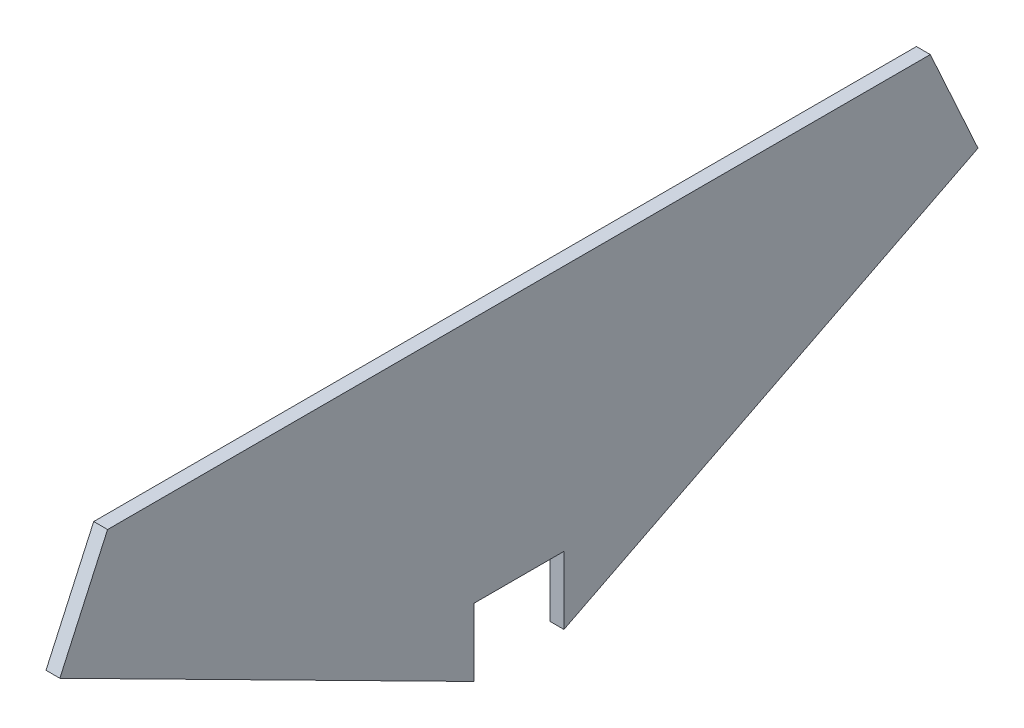
ISO-10303-21;
HEADER;
FILE_DESCRIPTION(('STEP AP214'),'2;1');
FILE_NAME('part.step','',(''),(''),'','','');
FILE_SCHEMA(('AUTOMOTIVE_DESIGN { 1 0 10303 214 1 1 1 1 }'));
ENDSEC;
DATA;
#1=APPLICATION_CONTEXT('core data for automotive mechanical design processes');
#2=APPLICATION_PROTOCOL_DEFINITION('international standard','automotive_design',2000,#1);
#3=PRODUCT_CONTEXT('',#1,'mechanical');
#4=PRODUCT('Part','Part','',(#3));
#5=PRODUCT_RELATED_PRODUCT_CATEGORY('part','',(#4));
#6=PRODUCT_DEFINITION_FORMATION('','',#4);
#7=PRODUCT_DEFINITION_CONTEXT('part definition',#1,'design');
#8=PRODUCT_DEFINITION('design','',#6,#7);
#9=PRODUCT_DEFINITION_SHAPE('','',#8);
#10=(LENGTH_UNIT() NAMED_UNIT(*) SI_UNIT(.MILLI.,.METRE.));
#11=(NAMED_UNIT(*) PLANE_ANGLE_UNIT() SI_UNIT($,.RADIAN.));
#12=(NAMED_UNIT(*) SI_UNIT($,.STERADIAN.) SOLID_ANGLE_UNIT());
#13=UNCERTAINTY_MEASURE_WITH_UNIT(LENGTH_MEASURE(1.E-05),#10,'distance_accuracy_value','');
#14=(GEOMETRIC_REPRESENTATION_CONTEXT(3) GLOBAL_UNCERTAINTY_ASSIGNED_CONTEXT((#13)) GLOBAL_UNIT_ASSIGNED_CONTEXT((#10,
#11,#12)) REPRESENTATION_CONTEXT('',''));
#15=CARTESIAN_POINT('',(0.,0.,0.));
#16=DIRECTION('',(0.,0.,1.));
#17=DIRECTION('',(1.,0.,0.));
#18=AXIS2_PLACEMENT_3D('',#15,#16,#17);
#19=CARTESIAN_POINT('',(6.,75.1104602945465,-173.429755419266));
#20=DIRECTION('',(0.,-0.413802944301184,0.910366477462605));
#21=DIRECTION('',(0.,-0.910366477462605,-0.413802944301184));
#22=AXIS2_PLACEMENT_3D('',#19,#20,#21);
#23=PLANE('',#22);
#24=DIRECTION('',(0.,0.910366477462605,0.413802944301184));
#25=VECTOR('',#24,1.);
#26=CARTESIAN_POINT('',(0.,75.1104602945465,-173.429755419266));
#27=LINE('',#26,#25);
#28=CARTESIAN_POINT('',(0.,29.6516334194965,-194.092858544289));
#29=VERTEX_POINT('',#28);
#30=CARTESIAN_POINT('',(0.,75.1104602945465,-173.429755419266));
#31=VERTEX_POINT('',#30);
#32=EDGE_CURVE('E129',#29,#31,#27,.T.);
#33=ORIENTED_EDGE('',*,*,#32,.T.);
#34=DIRECTION('',(-1.,0.,0.));
#35=VECTOR('',#34,1.);
#36=CARTESIAN_POINT('',(6.,75.1104602945465,-173.429755419266));
#37=LINE('',#36,#35);
#38=CARTESIAN_POINT('',(6.,75.1104602945465,-173.429755419266));
#39=VERTEX_POINT('',#38);
#40=EDGE_CURVE('E11',#39,#31,#37,.T.);
#41=ORIENTED_EDGE('',*,*,#40,.F.);
#42=DIRECTION('',(0.,0.910366477462605,0.413802944301184));
#43=VECTOR('',#42,1.);
#44=CARTESIAN_POINT('',(6.,75.1104602945465,-173.429755419266));
#45=LINE('',#44,#43);
#46=CARTESIAN_POINT('',(6.,29.6516334194965,-194.092858544289));
#47=VERTEX_POINT('',#46);
#48=EDGE_CURVE('E143',#47,#39,#45,.T.);
#49=ORIENTED_EDGE('',*,*,#48,.F.);
#50=DIRECTION('',(-1.,0.,0.));
#51=VECTOR('',#50,1.);
#52=CARTESIAN_POINT('',(6.,29.6516334194965,-194.092858544289));
#53=LINE('',#52,#51);
#54=EDGE_CURVE('E125',#47,#29,#53,.T.);
#55=ORIENTED_EDGE('',*,*,#54,.T.);
#56=EDGE_LOOP('',(#33,#41,#49,#55));
#57=FACE_BOUND('',#56,.T.);
#58=ADVANCED_FACE('F33',(#57),#23,.F.);
#59=CARTESIAN_POINT('',(6.,75.1104602945465,-173.429755419266));
#60=DIRECTION('',(0.,-1.,0.));
#61=DIRECTION('',(0.,0.,-1.));
#62=AXIS2_PLACEMENT_3D('',#59,#60,#61);
#63=PLANE('',#62);
#64=DIRECTION('',(0.,0.,1.));
#65=VECTOR('',#64,1.);
#66=CARTESIAN_POINT('',(0.,75.1104602945465,-173.429755419266));
#67=LINE('',#66,#65);
#68=CARTESIAN_POINT('',(0.,75.1104602945465,182.858071121388));
#69=VERTEX_POINT('',#68);
#70=EDGE_CURVE('E132',#31,#69,#67,.T.);
#71=ORIENTED_EDGE('',*,*,#70,.T.);
#72=DIRECTION('',(-1.,0.,0.));
#73=VECTOR('',#72,1.);
#74=CARTESIAN_POINT('',(6.,75.1104602945465,182.858071121388));
#75=LINE('',#74,#73);
#76=CARTESIAN_POINT('',(6.,75.1104602945465,182.858071121388));
#77=VERTEX_POINT('',#76);
#78=EDGE_CURVE('E41',#77,#69,#75,.T.);
#79=ORIENTED_EDGE('',*,*,#78,.F.);
#80=DIRECTION('',(0.,0.,1.));
#81=VECTOR('',#80,1.);
#82=CARTESIAN_POINT('',(6.,75.1104602945465,-173.429755419266));
#83=LINE('',#82,#81);
#84=EDGE_CURVE('E92',#39,#77,#83,.T.);
#85=ORIENTED_EDGE('',*,*,#84,.F.);
#86=ORIENTED_EDGE('',*,*,#40,.T.);
#87=EDGE_LOOP('',(#71,#79,#85,#86));
#88=FACE_BOUND('',#87,.T.);
#89=ADVANCED_FACE('F178',(#88),#63,.F.);
#90=CARTESIAN_POINT('',(6.,75.1104602945465,182.858071121388));
#91=DIRECTION('',(0.,-0.413802944301185,-0.910366477462604));
#92=DIRECTION('',(0.,0.910366477462605,-0.413802944301185));
#93=AXIS2_PLACEMENT_3D('',#90,#91,#92);
#94=PLANE('',#93);
#95=DIRECTION('',(0.,-0.910366477462604,0.413802944301185));
#96=VECTOR('',#95,1.);
#97=CARTESIAN_POINT('',(0.,75.1104602945465,182.858071121388));
#98=LINE('',#97,#96);
#99=CARTESIAN_POINT('',(0.,29.6516334194964,203.52117424641));
#100=VERTEX_POINT('',#99);
#101=EDGE_CURVE('E134',#69,#100,#98,.T.);
#102=ORIENTED_EDGE('',*,*,#101,.T.);
#103=DIRECTION('',(-1.,0.,0.));
#104=VECTOR('',#103,1.);
#105=CARTESIAN_POINT('',(6.,29.6516334194964,203.52117424641));
#106=LINE('',#105,#104);
#107=CARTESIAN_POINT('',(6.,29.6516334194964,203.52117424641));
#108=VERTEX_POINT('',#107);
#109=EDGE_CURVE('E150',#108,#100,#106,.T.);
#110=ORIENTED_EDGE('',*,*,#109,.F.);
#111=DIRECTION('',(0.,-0.910366477462604,0.413802944301185));
#112=VECTOR('',#111,1.);
#113=CARTESIAN_POINT('',(6.,75.1104602945465,182.858071121388));
#114=LINE('',#113,#112);
#115=EDGE_CURVE('E158',#77,#108,#114,.T.);
#116=ORIENTED_EDGE('',*,*,#115,.F.);
#117=ORIENTED_EDGE('',*,*,#78,.T.);
#118=EDGE_LOOP('',(#102,#110,#116,#117));
#119=FACE_BOUND('',#118,.T.);
#120=ADVANCED_FACE('F156',(#119),#94,.F.);
#121=CARTESIAN_POINT('',(6.,29.6516334194964,203.52117424641));
#122=DIRECTION('',(0.,0.892043028914365,-0.451950478000948));
#123=DIRECTION('',(0.,0.451950478000948,0.892043028914365));
#124=AXIS2_PLACEMENT_3D('',#121,#122,#123);
#125=PLANE('',#124);
#126=DIRECTION('',(0.,-0.451950478000948,-0.892043028914365));
#127=VECTOR('',#126,1.);
#128=CARTESIAN_POINT('',(0.,29.6516334194964,203.52117424641));
#129=LINE('',#128,#127);
#130=CARTESIAN_POINT('',(0.,-61.1936387726162,24.2141578510609));
#131=VERTEX_POINT('',#130);
#132=EDGE_CURVE('E136',#100,#131,#129,.T.);
#133=ORIENTED_EDGE('',*,*,#132,.T.);
#134=DIRECTION('',(-1.,0.,0.));
#135=VECTOR('',#134,1.);
#136=CARTESIAN_POINT('',(6.,-61.1936387726162,24.2141578510609));
#137=LINE('',#136,#135);
#138=CARTESIAN_POINT('',(6.,-61.1936387726162,24.2141578510609));
#139=VERTEX_POINT('',#138);
#140=EDGE_CURVE('E147',#139,#131,#137,.T.);
#141=ORIENTED_EDGE('',*,*,#140,.F.);
#142=DIRECTION('',(0.,-0.451950478000948,-0.892043028914365));
#143=VECTOR('',#142,1.);
#144=CARTESIAN_POINT('',(6.,29.6516334194964,203.52117424641));
#145=LINE('',#144,#143);
#146=EDGE_CURVE('E170',#108,#139,#145,.T.);
#147=ORIENTED_EDGE('',*,*,#146,.F.);
#148=ORIENTED_EDGE('',*,*,#109,.T.);
#149=EDGE_LOOP('',(#133,#141,#147,#148));
#150=FACE_BOUND('',#149,.T.);
#151=ADVANCED_FACE('F166',(#150),#125,.F.);
#152=CARTESIAN_POINT('',(6.,-61.1936387726162,24.2141578510609));
#153=DIRECTION('',(0.,0.,1.));
#154=DIRECTION('',(1.,0.,0.));
#155=AXIS2_PLACEMENT_3D('',#152,#153,#154);
#156=PLANE('',#155);
#157=DIRECTION('',(0.,1.,0.));
#158=VECTOR('',#157,1.);
#159=CARTESIAN_POINT('',(0.,-61.1936387726162,24.2141578510609));
#160=LINE('',#159,#158);
#161=CARTESIAN_POINT('',(0.,-31.8895397054537,24.2141578510609));
#162=VERTEX_POINT('',#161);
#163=EDGE_CURVE('E138',#131,#162,#160,.T.);
#164=ORIENTED_EDGE('',*,*,#163,.T.);
#165=DIRECTION('',(-1.,0.,0.));
#166=VECTOR('',#165,1.);
#167=CARTESIAN_POINT('',(6.,-31.8895397054537,24.2141578510609));
#168=LINE('',#167,#166);
#169=CARTESIAN_POINT('',(6.,-31.8895397054537,24.2141578510609));
#170=VERTEX_POINT('',#169);
#171=EDGE_CURVE('E120',#170,#162,#168,.T.);
#172=ORIENTED_EDGE('',*,*,#171,.F.);
#173=DIRECTION('',(0.,1.,0.));
#174=VECTOR('',#173,1.);
#175=CARTESIAN_POINT('',(6.,-61.1936387726162,24.2141578510609));
#176=LINE('',#175,#174);
#177=EDGE_CURVE('E111',#139,#170,#176,.T.);
#178=ORIENTED_EDGE('',*,*,#177,.F.);
#179=ORIENTED_EDGE('',*,*,#140,.T.);
#180=EDGE_LOOP('',(#164,#172,#178,#179));
#181=FACE_BOUND('',#180,.T.);
#182=ADVANCED_FACE('F169',(#181),#156,.F.);
#183=CARTESIAN_POINT('',(6.,-31.8895397054537,24.2141578510609));
#184=DIRECTION('',(0.,1.,0.));
#185=DIRECTION('',(0.,0.,1.));
#186=AXIS2_PLACEMENT_3D('',#183,#184,#185);
#187=PLANE('',#186);
#188=DIRECTION('',(0.,0.,-1.));
#189=VECTOR('',#188,1.);
#190=CARTESIAN_POINT('',(0.,-31.8895397054537,24.2141578510609));
#191=LINE('',#190,#189);
#192=CARTESIAN_POINT('',(0.,-31.8895397054537,-14.7858421489391));
#193=VERTEX_POINT('',#192);
#194=EDGE_CURVE('E119',#162,#193,#191,.T.);
#195=ORIENTED_EDGE('',*,*,#194,.T.);
#196=DIRECTION('',(-1.,0.,0.));
#197=VECTOR('',#196,1.);
#198=CARTESIAN_POINT('',(6.,-31.8895397054537,-14.7858421489391));
#199=LINE('',#198,#197);
#200=CARTESIAN_POINT('',(6.,-31.8895397054537,-14.7858421489391));
#201=VERTEX_POINT('',#200);
#202=EDGE_CURVE('E116',#201,#193,#199,.T.);
#203=ORIENTED_EDGE('',*,*,#202,.F.);
#204=DIRECTION('',(0.,0.,-1.));
#205=VECTOR('',#204,1.);
#206=CARTESIAN_POINT('',(6.,-31.8895397054537,24.2141578510609));
#207=LINE('',#206,#205);
#208=EDGE_CURVE('E105',#170,#201,#207,.T.);
#209=ORIENTED_EDGE('',*,*,#208,.F.);
#210=ORIENTED_EDGE('',*,*,#171,.T.);
#211=EDGE_LOOP('',(#195,#203,#209,#210));
#212=FACE_BOUND('',#211,.T.);
#213=ADVANCED_FACE('F117',(#212),#187,.F.);
#214=CARTESIAN_POINT('',(6.,-61.1936387726162,-14.7858421489391));
#215=DIRECTION('',(0.,0.,-1.));
#216=DIRECTION('',(-1.,0.,0.));
#217=AXIS2_PLACEMENT_3D('',#214,#215,#216);
#218=PLANE('',#217);
#219=DIRECTION('',(0.,-1.,0.));
#220=VECTOR('',#219,1.);
#221=CARTESIAN_POINT('',(0.,-61.1936387726162,-14.7858421489391));
#222=LINE('',#221,#220);
#223=CARTESIAN_POINT('',(0.,-61.1936387726162,-14.7858421489391));
#224=VERTEX_POINT('',#223);
#225=EDGE_CURVE('E78',#193,#224,#222,.T.);
#226=ORIENTED_EDGE('',*,*,#225,.T.);
#227=DIRECTION('',(-1.,0.,0.));
#228=VECTOR('',#227,1.);
#229=CARTESIAN_POINT('',(6.,-61.1936387726162,-14.7858421489391));
#230=LINE('',#229,#228);
#231=CARTESIAN_POINT('',(6.,-61.1936387726162,-14.7858421489391));
#232=VERTEX_POINT('',#231);
#233=EDGE_CURVE('E121',#232,#224,#230,.T.);
#234=ORIENTED_EDGE('',*,*,#233,.F.);
#235=DIRECTION('',(0.,-1.,0.));
#236=VECTOR('',#235,1.);
#237=CARTESIAN_POINT('',(6.,-61.1936387726162,-14.7858421489391));
#238=LINE('',#237,#236);
#239=EDGE_CURVE('E109',#201,#232,#238,.T.);
#240=ORIENTED_EDGE('',*,*,#239,.F.);
#241=ORIENTED_EDGE('',*,*,#202,.T.);
#242=EDGE_LOOP('',(#226,#234,#240,#241));
#243=FACE_BOUND('',#242,.T.);
#244=ADVANCED_FACE('F123',(#243),#218,.F.);
#245=CARTESIAN_POINT('',(6.,29.6516334194965,-194.092858544289));
#246=DIRECTION('',(0.,0.892043028914364,0.451950478000948));
#247=DIRECTION('',(0.,-0.451950478000949,0.892043028914365));
#248=AXIS2_PLACEMENT_3D('',#245,#246,#247);
#249=PLANE('',#248);
#250=DIRECTION('',(0.,0.451950478000949,-0.892043028914365));
#251=VECTOR('',#250,1.);
#252=CARTESIAN_POINT('',(0.,29.6516334194965,-194.092858544289));
#253=LINE('',#252,#251);
#254=EDGE_CURVE('E84',#224,#29,#253,.T.);
#255=ORIENTED_EDGE('',*,*,#254,.T.);
#256=ORIENTED_EDGE('',*,*,#54,.F.);
#257=DIRECTION('',(0.,0.451950478000949,-0.892043028914365));
#258=VECTOR('',#257,1.);
#259=CARTESIAN_POINT('',(6.,29.6516334194965,-194.092858544289));
#260=LINE('',#259,#258);
#261=EDGE_CURVE('E49',#232,#47,#260,.T.);
#262=ORIENTED_EDGE('',*,*,#261,.F.);
#263=ORIENTED_EDGE('',*,*,#233,.T.);
#264=EDGE_LOOP('',(#255,#256,#262,#263));
#265=FACE_BOUND('',#264,.T.);
#266=ADVANCED_FACE('F194',(#265),#249,.F.);
#267=CARTESIAN_POINT('',(6.,0.,0.));
#268=DIRECTION('',(-1.,0.,0.));
#269=DIRECTION('',(0.,0.,1.));
#270=AXIS2_PLACEMENT_3D('',#267,#268,#269);
#271=PLANE('',#270);
#272=ORIENTED_EDGE('',*,*,#48,.T.);
#273=ORIENTED_EDGE('',*,*,#84,.T.);
#274=ORIENTED_EDGE('',*,*,#115,.T.);
#275=ORIENTED_EDGE('',*,*,#146,.T.);
#276=ORIENTED_EDGE('',*,*,#177,.T.);
#277=ORIENTED_EDGE('',*,*,#208,.T.);
#278=ORIENTED_EDGE('',*,*,#239,.T.);
#279=ORIENTED_EDGE('',*,*,#261,.T.);
#280=EDGE_LOOP('',(#272,#273,#274,#275,#276,#277,#278,#279));
#281=FACE_BOUND('',#280,.T.);
#282=ADVANCED_FACE('F107',(#281),#271,.F.);
#283=CARTESIAN_POINT('',(0.,0.,0.));
#284=DIRECTION('',(-1.,0.,0.));
#285=DIRECTION('',(0.,0.,1.));
#286=AXIS2_PLACEMENT_3D('',#283,#284,#285);
#287=PLANE('',#286);
#288=ORIENTED_EDGE('',*,*,#32,.F.);
#289=ORIENTED_EDGE('',*,*,#254,.F.);
#290=ORIENTED_EDGE('',*,*,#225,.F.);
#291=ORIENTED_EDGE('',*,*,#194,.F.);
#292=ORIENTED_EDGE('',*,*,#163,.F.);
#293=ORIENTED_EDGE('',*,*,#132,.F.);
#294=ORIENTED_EDGE('',*,*,#101,.F.);
#295=ORIENTED_EDGE('',*,*,#70,.F.);
#296=EDGE_LOOP('',(#288,#289,#290,#291,#292,#293,#294,#295));
#297=FACE_BOUND('',#296,.T.);
#298=ADVANCED_FACE('F162',(#297),#287,.T.);
#299=CLOSED_SHELL('',(#58,#89,#120,#151,#182,#213,#244,#266,#282,#298));
#300=MANIFOLD_SOLID_BREP('B2',#299);
#301=ADVANCED_BREP_SHAPE_REPRESENTATION('',(#18,#300),#14);
#302=SHAPE_DEFINITION_REPRESENTATION(#9,#301);
ENDSEC;
END-ISO-10303-21;
